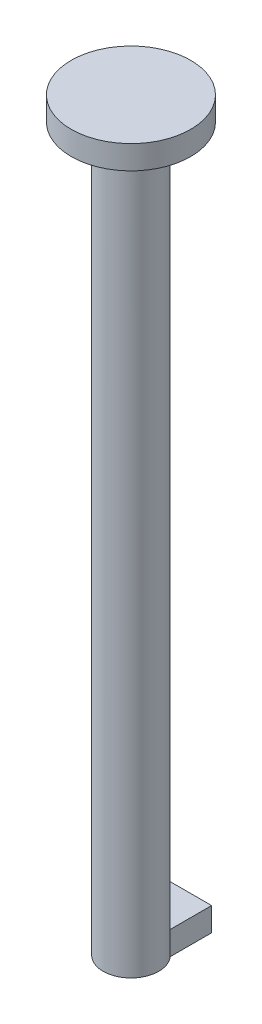
ISO-10303-21;
HEADER;
FILE_DESCRIPTION(('STEP AP214'),'2;1');
FILE_NAME('part.step','',(''),(''),'','','');
FILE_SCHEMA(('AUTOMOTIVE_DESIGN { 1 0 10303 214 1 1 1 1 }'));
ENDSEC;
DATA;
#1=APPLICATION_CONTEXT('core data for automotive mechanical design processes');
#2=APPLICATION_PROTOCOL_DEFINITION('international standard','automotive_design',2000,#1);
#3=PRODUCT_CONTEXT('',#1,'mechanical');
#4=PRODUCT('Part','Part','',(#3));
#5=PRODUCT_RELATED_PRODUCT_CATEGORY('part','',(#4));
#6=PRODUCT_DEFINITION_FORMATION('','',#4);
#7=PRODUCT_DEFINITION_CONTEXT('part definition',#1,'design');
#8=PRODUCT_DEFINITION('design','',#6,#7);
#9=PRODUCT_DEFINITION_SHAPE('','',#8);
#10=(LENGTH_UNIT() NAMED_UNIT(*) SI_UNIT(.MILLI.,.METRE.));
#11=(NAMED_UNIT(*) PLANE_ANGLE_UNIT() SI_UNIT($,.RADIAN.));
#12=(NAMED_UNIT(*) SI_UNIT($,.STERADIAN.) SOLID_ANGLE_UNIT());
#13=UNCERTAINTY_MEASURE_WITH_UNIT(LENGTH_MEASURE(1.E-05),#10,'distance_accuracy_value','');
#14=(GEOMETRIC_REPRESENTATION_CONTEXT(3) GLOBAL_UNCERTAINTY_ASSIGNED_CONTEXT((#13)) GLOBAL_UNIT_ASSIGNED_CONTEXT((#10,
#11,#12)) REPRESENTATION_CONTEXT('',''));
#15=CARTESIAN_POINT('',(0.,0.,0.));
#16=DIRECTION('',(0.,0.,1.));
#17=DIRECTION('',(1.,0.,0.));
#18=AXIS2_PLACEMENT_3D('',#15,#16,#17);
#19=CARTESIAN_POINT('',(-101.6,57.9842048968553,-101.6));
#20=DIRECTION('',(0.,-1.,0.));
#21=DIRECTION('',(1.,0.,0.));
#22=AXIS2_PLACEMENT_3D('',#19,#20,#21);
#23=CYLINDRICAL_SURFACE('',#22,2.53999999999999);
#24=DIRECTION('',(0.,-1.,0.));
#25=VECTOR('',#24,1.);
#26=CARTESIAN_POINT('',(-99.695,-0.127000000000002,-103.280052082526));
#27=LINE('',#26,#25);
#28=CARTESIAN_POINT('',(-99.695,-0.127000000000002,-103.280052082526));
#29=VERTEX_POINT('',#28);
#30=CARTESIAN_POINT('',(-99.695,-2.286,-103.280052082526));
#31=VERTEX_POINT('',#30);
#32=EDGE_CURVE('E103',#29,#31,#27,.T.);
#33=ORIENTED_EDGE('',*,*,#32,.F.);
#34=CARTESIAN_POINT('',(-101.6,-0.127000000000002,-101.6));
#35=DIRECTION('',(0.,-1.,0.));
#36=DIRECTION('',(0.,0.,-1.));
#37=AXIS2_PLACEMENT_3D('',#34,#35,#36);
#38=CIRCLE('',#37,2.53999999999999);
#39=CARTESIAN_POINT('',(-103.505,-0.127000000000002,-103.280052082526));
#40=VERTEX_POINT('',#39);
#41=EDGE_CURVE('E54',#40,#29,#38,.T.);
#42=ORIENTED_EDGE('',*,*,#41,.F.);
#43=DIRECTION('',(0.,-1.,0.));
#44=VECTOR('',#43,1.);
#45=CARTESIAN_POINT('',(-103.505,-0.127000000000002,-103.280052082526));
#46=LINE('',#45,#44);
#47=CARTESIAN_POINT('',(-103.505,-2.286,-103.280052082526));
#48=VERTEX_POINT('',#47);
#49=EDGE_CURVE('E109',#40,#48,#46,.T.);
#50=ORIENTED_EDGE('',*,*,#49,.T.);
#51=CARTESIAN_POINT('',(-101.6,-2.286,-101.6));
#52=DIRECTION('',(0.,-1.,0.));
#53=DIRECTION('',(0.,0.,-1.));
#54=AXIS2_PLACEMENT_3D('',#51,#52,#53);
#55=CIRCLE('',#54,2.53999999999999);
#56=EDGE_CURVE('E100',#31,#48,#55,.T.);
#57=ORIENTED_EDGE('',*,*,#56,.F.);
#58=EDGE_LOOP('',(#33,#42,#50,#57));
#59=FACE_BOUND('',#58,.T.);
#60=CARTESIAN_POINT('',(-101.6,63.627,-101.6));
#61=DIRECTION('',(0.,1.,0.));
#62=DIRECTION('',(0.,0.,1.));
#63=AXIS2_PLACEMENT_3D('',#60,#61,#62);
#64=CIRCLE('',#63,2.53999999999999);
#65=CARTESIAN_POINT('',(-101.6,63.627,-99.06));
#66=VERTEX_POINT('',#65);
#67=EDGE_CURVE('E12',#66,#66,#64,.T.);
#68=ORIENTED_EDGE('',*,*,#67,.F.);
#69=EDGE_LOOP('',(#68));
#70=FACE_BOUND('',#69,.T.);
#71=ADVANCED_FACE('F47',(#59,#70),#23,.T.);
#72=CARTESIAN_POINT('',(-101.6,-2.286,-101.6));
#73=DIRECTION('',(0.,-1.,0.));
#74=DIRECTION('',(0.,0.,-1.));
#75=AXIS2_PLACEMENT_3D('',#72,#73,#74);
#76=PLANE('',#75);
#77=ORIENTED_EDGE('',*,*,#56,.T.);
#78=DIRECTION('',(0.,0.,-1.));
#79=VECTOR('',#78,1.);
#80=CARTESIAN_POINT('',(-103.505,-2.286,0.));
#81=LINE('',#80,#79);
#82=CARTESIAN_POINT('',(-103.505,-2.286,-107.061));
#83=VERTEX_POINT('',#82);
#84=EDGE_CURVE('E117',#48,#83,#81,.T.);
#85=ORIENTED_EDGE('',*,*,#84,.T.);
#86=DIRECTION('',(1.,0.,0.));
#87=VECTOR('',#86,1.);
#88=CARTESIAN_POINT('',(0.,-2.286,-107.061));
#89=LINE('',#88,#87);
#90=CARTESIAN_POINT('',(-99.695,-2.286,-107.061));
#91=VERTEX_POINT('',#90);
#92=EDGE_CURVE('E120',#83,#91,#89,.T.);
#93=ORIENTED_EDGE('',*,*,#92,.T.);
#94=DIRECTION('',(0.,0.,-1.));
#95=VECTOR('',#94,1.);
#96=CARTESIAN_POINT('',(-99.695,-2.286,0.));
#97=LINE('',#96,#95);
#98=EDGE_CURVE('E61',#31,#91,#97,.T.);
#99=ORIENTED_EDGE('',*,*,#98,.F.);
#100=EDGE_LOOP('',(#77,#85,#93,#99));
#101=FACE_BOUND('',#100,.T.);
#102=ADVANCED_FACE('F149',(#101),#76,.T.);
#103=CARTESIAN_POINT('',(0.,-0.127000000000002,-107.061));
#104=DIRECTION('',(0.,0.,-1.));
#105=DIRECTION('',(-1.,0.,0.));
#106=AXIS2_PLACEMENT_3D('',#103,#104,#105);
#107=PLANE('',#106);
#108=ORIENTED_EDGE('',*,*,#92,.F.);
#109=DIRECTION('',(0.,-1.,0.));
#110=VECTOR('',#109,1.);
#111=CARTESIAN_POINT('',(-103.505,-0.127000000000002,-107.061));
#112=LINE('',#111,#110);
#113=CARTESIAN_POINT('',(-103.505,-0.127000000000002,-107.061));
#114=VERTEX_POINT('',#113);
#115=EDGE_CURVE('E70',#114,#83,#112,.T.);
#116=ORIENTED_EDGE('',*,*,#115,.F.);
#117=DIRECTION('',(1.,0.,0.));
#118=VECTOR('',#117,1.);
#119=CARTESIAN_POINT('',(0.,-0.127000000000002,-107.061));
#120=LINE('',#119,#118);
#121=CARTESIAN_POINT('',(-99.695,-0.127000000000002,-107.061));
#122=VERTEX_POINT('',#121);
#123=EDGE_CURVE('E106',#114,#122,#120,.T.);
#124=ORIENTED_EDGE('',*,*,#123,.T.);
#125=DIRECTION('',(0.,-1.,0.));
#126=VECTOR('',#125,1.);
#127=CARTESIAN_POINT('',(-99.695,-0.127000000000002,-107.061));
#128=LINE('',#127,#126);
#129=EDGE_CURVE('E105',#122,#91,#128,.T.);
#130=ORIENTED_EDGE('',*,*,#129,.T.);
#131=EDGE_LOOP('',(#108,#116,#124,#130));
#132=FACE_BOUND('',#131,.T.);
#133=ADVANCED_FACE('F155',(#132),#107,.T.);
#134=CARTESIAN_POINT('',(-103.505,-0.127000000000002,0.));
#135=DIRECTION('',(-1.,0.,0.));
#136=DIRECTION('',(0.,0.,1.));
#137=AXIS2_PLACEMENT_3D('',#134,#135,#136);
#138=PLANE('',#137);
#139=ORIENTED_EDGE('',*,*,#84,.F.);
#140=ORIENTED_EDGE('',*,*,#49,.F.);
#141=DIRECTION('',(0.,0.,-1.));
#142=VECTOR('',#141,1.);
#143=CARTESIAN_POINT('',(-103.505,-0.127000000000002,0.));
#144=LINE('',#143,#142);
#145=EDGE_CURVE('E96',#40,#114,#144,.T.);
#146=ORIENTED_EDGE('',*,*,#145,.T.);
#147=ORIENTED_EDGE('',*,*,#115,.T.);
#148=EDGE_LOOP('',(#139,#140,#146,#147));
#149=FACE_BOUND('',#148,.T.);
#150=ADVANCED_FACE('F160',(#149),#138,.T.);
#151=CARTESIAN_POINT('',(-99.695,-0.127000000000002,0.));
#152=DIRECTION('',(-1.,0.,0.));
#153=DIRECTION('',(0.,0.,1.));
#154=AXIS2_PLACEMENT_3D('',#151,#152,#153);
#155=PLANE('',#154);
#156=ORIENTED_EDGE('',*,*,#98,.T.);
#157=ORIENTED_EDGE('',*,*,#129,.F.);
#158=DIRECTION('',(0.,0.,-1.));
#159=VECTOR('',#158,1.);
#160=CARTESIAN_POINT('',(-99.695,-0.127000000000002,0.));
#161=LINE('',#160,#159);
#162=EDGE_CURVE('E91',#29,#122,#161,.T.);
#163=ORIENTED_EDGE('',*,*,#162,.F.);
#164=ORIENTED_EDGE('',*,*,#32,.T.);
#165=EDGE_LOOP('',(#156,#157,#163,#164));
#166=FACE_BOUND('',#165,.T.);
#167=ADVANCED_FACE('F102',(#166),#155,.F.);
#168=CARTESIAN_POINT('',(0.,-0.127000000000002,0.));
#169=DIRECTION('',(0.,-1.,0.));
#170=DIRECTION('',(0.,0.,-1.));
#171=AXIS2_PLACEMENT_3D('',#168,#169,#170);
#172=PLANE('',#171);
#173=ORIENTED_EDGE('',*,*,#145,.F.);
#174=ORIENTED_EDGE('',*,*,#41,.T.);
#175=ORIENTED_EDGE('',*,*,#162,.T.);
#176=ORIENTED_EDGE('',*,*,#123,.F.);
#177=EDGE_LOOP('',(#173,#174,#175,#176));
#178=FACE_BOUND('',#177,.T.);
#179=ADVANCED_FACE('F95',(#178),#172,.F.);
#180=CARTESIAN_POINT('',(-101.6,63.627,-101.6));
#181=DIRECTION('',(0.,1.,0.));
#182=DIRECTION('',(0.,0.,1.));
#183=AXIS2_PLACEMENT_3D('',#180,#181,#182);
#184=CYLINDRICAL_SURFACE('',#183,5.46099999999999);
#185=CARTESIAN_POINT('',(-101.6,63.627,-101.6));
#186=DIRECTION('',(0.,1.,0.));
#187=DIRECTION('',(0.,0.,1.));
#188=AXIS2_PLACEMENT_3D('',#185,#186,#187);
#189=CIRCLE('',#188,5.46099999999999);
#190=CARTESIAN_POINT('',(-101.6,63.627,-96.139));
#191=VERTEX_POINT('',#190);
#192=EDGE_CURVE('E122',#191,#191,#189,.T.);
#193=ORIENTED_EDGE('',*,*,#192,.T.);
#194=EDGE_LOOP('',(#193));
#195=FACE_BOUND('',#194,.T.);
#196=CARTESIAN_POINT('',(-101.6,65.786,-101.6));
#197=DIRECTION('',(0.,1.,0.));
#198=DIRECTION('',(0.,0.,1.));
#199=AXIS2_PLACEMENT_3D('',#196,#197,#198);
#200=CIRCLE('',#199,5.46099999999999);
#201=CARTESIAN_POINT('',(-101.6,65.786,-96.139));
#202=VERTEX_POINT('',#201);
#203=EDGE_CURVE('E125',#202,#202,#200,.T.);
#204=ORIENTED_EDGE('',*,*,#203,.F.);
#205=EDGE_LOOP('',(#204));
#206=FACE_BOUND('',#205,.T.);
#207=ADVANCED_FACE('F131',(#195,#206),#184,.T.);
#208=CARTESIAN_POINT('',(-101.6,63.627,-101.6));
#209=DIRECTION('',(0.,1.,0.));
#210=DIRECTION('',(0.,0.,1.));
#211=AXIS2_PLACEMENT_3D('',#208,#209,#210);
#212=PLANE('',#211);
#213=ORIENTED_EDGE('',*,*,#67,.T.);
#214=EDGE_LOOP('',(#213));
#215=FACE_BOUND('',#214,.T.);
#216=ORIENTED_EDGE('',*,*,#192,.F.);
#217=EDGE_LOOP('',(#216));
#218=FACE_BOUND('',#217,.T.);
#219=ADVANCED_FACE('F134',(#215,#218),#212,.F.);
#220=CARTESIAN_POINT('',(-101.6,65.786,-101.6));
#221=DIRECTION('',(0.,1.,0.));
#222=DIRECTION('',(0.,0.,1.));
#223=AXIS2_PLACEMENT_3D('',#220,#221,#222);
#224=PLANE('',#223);
#225=ORIENTED_EDGE('',*,*,#203,.T.);
#226=EDGE_LOOP('',(#225));
#227=FACE_BOUND('',#226,.T.);
#228=ADVANCED_FACE('F136',(#227),#224,.T.);
#229=CLOSED_SHELL('',(#71,#102,#133,#150,#167,#179,#207,#219,#228));
#230=MANIFOLD_SOLID_BREP('B2',#229);
#231=ADVANCED_BREP_SHAPE_REPRESENTATION('',(#18,#230),#14);
#232=SHAPE_DEFINITION_REPRESENTATION(#9,#231);
ENDSEC;
END-ISO-10303-21;
